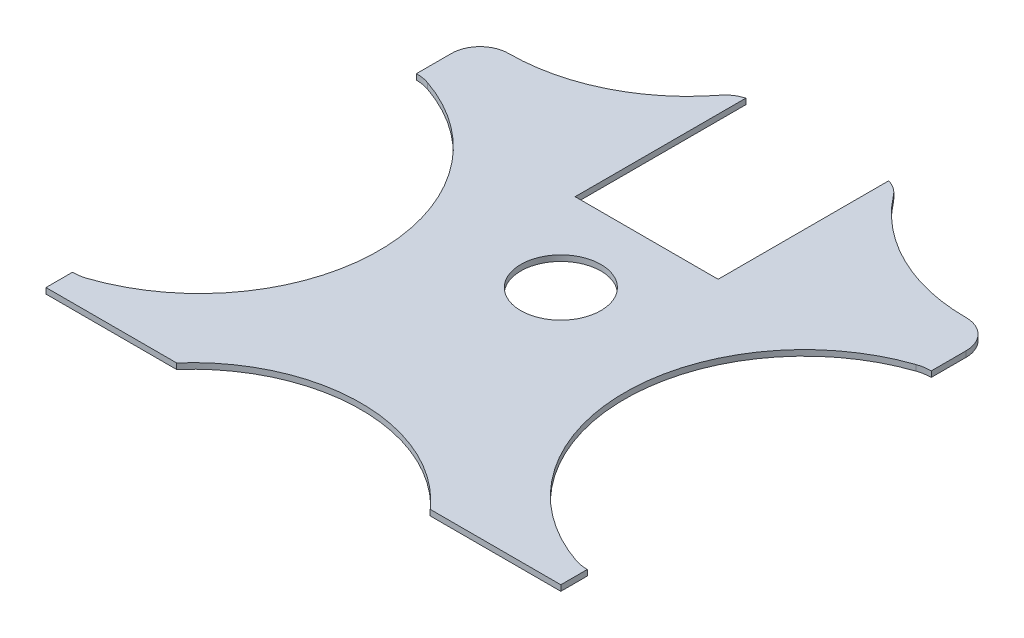
ISO-10303-21;
HEADER;
FILE_DESCRIPTION(('STEP AP214'),'2;1');
FILE_NAME('part.step','',(''),(''),'','','');
FILE_SCHEMA(('AUTOMOTIVE_DESIGN { 1 0 10303 214 1 1 1 1 }'));
ENDSEC;
DATA;
#1=APPLICATION_CONTEXT('core data for automotive mechanical design processes');
#2=APPLICATION_PROTOCOL_DEFINITION('international standard','automotive_design',2000,#1);
#3=PRODUCT_CONTEXT('',#1,'mechanical');
#4=PRODUCT('Part','Part','',(#3));
#5=PRODUCT_RELATED_PRODUCT_CATEGORY('part','',(#4));
#6=PRODUCT_DEFINITION_FORMATION('','',#4);
#7=PRODUCT_DEFINITION_CONTEXT('part definition',#1,'design');
#8=PRODUCT_DEFINITION('design','',#6,#7);
#9=PRODUCT_DEFINITION_SHAPE('','',#8);
#10=(LENGTH_UNIT() NAMED_UNIT(*) SI_UNIT(.MILLI.,.METRE.));
#11=(NAMED_UNIT(*) PLANE_ANGLE_UNIT() SI_UNIT($,.RADIAN.));
#12=(NAMED_UNIT(*) SI_UNIT($,.STERADIAN.) SOLID_ANGLE_UNIT());
#13=UNCERTAINTY_MEASURE_WITH_UNIT(LENGTH_MEASURE(1.E-05),#10,'distance_accuracy_value','');
#14=(GEOMETRIC_REPRESENTATION_CONTEXT(3) GLOBAL_UNCERTAINTY_ASSIGNED_CONTEXT((#13)) GLOBAL_UNIT_ASSIGNED_CONTEXT((#10,
#11,#12)) REPRESENTATION_CONTEXT('',''));
#15=CARTESIAN_POINT('',(0.,0.,0.));
#16=DIRECTION('',(0.,0.,1.));
#17=DIRECTION('',(1.,0.,0.));
#18=AXIS2_PLACEMENT_3D('',#15,#16,#17);
#19=CARTESIAN_POINT('',(90.,2.,90.));
#20=DIRECTION('',(-1.,0.,0.));
#21=DIRECTION('',(0.,0.,1.));
#22=AXIS2_PLACEMENT_3D('',#19,#20,#21);
#23=PLANE('',#22);
#24=DIRECTION('',(0.,1.,0.));
#25=VECTOR('',#24,1.);
#26=CARTESIAN_POINT('',(90.,-1.,-51.7417552269774));
#27=LINE('',#26,#25);
#28=CARTESIAN_POINT('',(90.,0.,-51.7417552269774));
#29=VERTEX_POINT('',#28);
#30=CARTESIAN_POINT('',(90.,2.,-51.7417552269774));
#31=VERTEX_POINT('',#30);
#32=EDGE_CURVE('E339',#29,#31,#27,.T.);
#33=ORIENTED_EDGE('',*,*,#32,.T.);
#34=DIRECTION('',(0.,0.,-1.));
#35=VECTOR('',#34,1.);
#36=CARTESIAN_POINT('',(90.,2.,90.));
#37=LINE('',#36,#35);
#38=CARTESIAN_POINT('',(90.,2.,-39.5269876063135));
#39=VERTEX_POINT('',#38);
#40=EDGE_CURVE('E228',#39,#31,#37,.T.);
#41=ORIENTED_EDGE('',*,*,#40,.F.);
#42=DIRECTION('',(0.,1.,0.));
#43=VECTOR('',#42,1.);
#44=CARTESIAN_POINT('',(90.,-8.,-39.5269876063135));
#45=LINE('',#44,#43);
#46=CARTESIAN_POINT('',(90.,0.,-39.5269876063135));
#47=VERTEX_POINT('',#46);
#48=EDGE_CURVE('E316',#47,#39,#45,.T.);
#49=ORIENTED_EDGE('',*,*,#48,.F.);
#50=DIRECTION('',(0.,0.,-1.));
#51=VECTOR('',#50,1.);
#52=CARTESIAN_POINT('',(90.,0.,90.));
#53=LINE('',#52,#51);
#54=EDGE_CURVE('E221',#47,#29,#53,.T.);
#55=ORIENTED_EDGE('',*,*,#54,.T.);
#56=EDGE_LOOP('',(#33,#41,#49,#55));
#57=FACE_BOUND('',#56,.T.);
#58=ADVANCED_FACE('F33',(#57),#23,.F.);
#59=CARTESIAN_POINT('',(-90.,2.,90.));
#60=DIRECTION('',(0.,0.,-1.));
#61=DIRECTION('',(-1.,0.,0.));
#62=AXIS2_PLACEMENT_3D('',#59,#60,#61);
#63=PLANE('',#62);
#64=DIRECTION('',(1.,0.,0.));
#65=VECTOR('',#64,1.);
#66=CARTESIAN_POINT('',(-90.,2.,90.));
#67=LINE('',#66,#65);
#68=CARTESIAN_POINT('',(44.3381268338623,2.,90.));
#69=VERTEX_POINT('',#68);
#70=CARTESIAN_POINT('',(90.,2.,90.));
#71=VERTEX_POINT('',#70);
#72=EDGE_CURVE('E206',#69,#71,#67,.T.);
#73=ORIENTED_EDGE('',*,*,#72,.F.);
#74=DIRECTION('',(0.,-1.,0.));
#75=VECTOR('',#74,1.);
#76=CARTESIAN_POINT('',(44.3381268338623,320.20787230991,90.));
#77=LINE('',#76,#75);
#78=CARTESIAN_POINT('',(44.3381268338623,0.,90.));
#79=VERTEX_POINT('',#78);
#80=EDGE_CURVE('E253',#69,#79,#77,.T.);
#81=ORIENTED_EDGE('',*,*,#80,.T.);
#82=DIRECTION('',(1.,0.,0.));
#83=VECTOR('',#82,1.);
#84=CARTESIAN_POINT('',(-90.,0.,90.));
#85=LINE('',#84,#83);
#86=CARTESIAN_POINT('',(90.,0.,90.));
#87=VERTEX_POINT('',#86);
#88=EDGE_CURVE('E224',#79,#87,#85,.T.);
#89=ORIENTED_EDGE('',*,*,#88,.T.);
#90=DIRECTION('',(0.,-1.,0.));
#91=VECTOR('',#90,1.);
#92=CARTESIAN_POINT('',(90.,2.,90.));
#93=LINE('',#92,#91);
#94=EDGE_CURVE('E216',#71,#87,#93,.T.);
#95=ORIENTED_EDGE('',*,*,#94,.F.);
#96=EDGE_LOOP('',(#73,#81,#89,#95));
#97=FACE_BOUND('',#96,.T.);
#98=ADVANCED_FACE('F394',(#97),#63,.F.);
#99=DIRECTION('',(0.,1.,0.));
#100=VECTOR('',#99,1.);
#101=CARTESIAN_POINT('',(90.,-8.,80.7603527714543));
#102=LINE('',#101,#100);
#103=CARTESIAN_POINT('',(90.,2.,80.7603527714543));
#104=VERTEX_POINT('',#103);
#105=CARTESIAN_POINT('',(90.,0.,80.7603527714543));
#106=VERTEX_POINT('',#105);
#107=EDGE_CURVE('E314',#104,#106,#102,.F.);
#108=ORIENTED_EDGE('',*,*,#107,.F.);
#109=EDGE_CURVE('E211',#71,#104,#37,.T.);
#110=ORIENTED_EDGE('',*,*,#109,.F.);
#111=ORIENTED_EDGE('',*,*,#94,.T.);
#112=EDGE_CURVE('E217',#87,#106,#53,.T.);
#113=ORIENTED_EDGE('',*,*,#112,.T.);
#114=EDGE_LOOP('',(#108,#110,#111,#113));
#115=FACE_BOUND('',#114,.T.);
#116=ADVANCED_FACE('F35',(#115),#23,.F.);
#117=CARTESIAN_POINT('',(89.9999999999999,2.,-90.));
#118=DIRECTION('',(0.,-1.,0.));
#119=DIRECTION('',(0.,0.,-1.));
#120=AXIS2_PLACEMENT_3D('',#117,#118,#119);
#121=PLANE('',#120);
#122=CARTESIAN_POINT('',(0.,2.,0.));
#123=DIRECTION('',(0.,1.,0.));
#124=DIRECTION('',(0.,0.,1.));
#125=AXIS2_PLACEMENT_3D('',#122,#123,#124);
#126=CIRCLE('',#125,14.);
#127=CARTESIAN_POINT('',(0.,2.,14.));
#128=VERTEX_POINT('',#127);
#129=EDGE_CURVE('E261',#128,#128,#126,.T.);
#130=ORIENTED_EDGE('',*,*,#129,.F.);
#131=EDGE_LOOP('',(#130));
#132=FACE_BOUND('',#131,.T.);
#133=DIRECTION('',(0.,0.,1.));
#134=VECTOR('',#133,1.);
#135=CARTESIAN_POINT('',(-25.,2.,-30.));
#136=LINE('',#135,#134);
#137=CARTESIAN_POINT('',(-25.,2.,-89.6654970319852));
#138=VERTEX_POINT('',#137);
#139=CARTESIAN_POINT('',(-25.,2.,-30.));
#140=VERTEX_POINT('',#139);
#141=EDGE_CURVE('E271',#138,#140,#136,.T.);
#142=ORIENTED_EDGE('',*,*,#141,.F.);
#143=CARTESIAN_POINT('',(-22.4352062218018,2.,-80.));
#144=DIRECTION('',(0.,-1.,0.));
#145=DIRECTION('',(0.,0.,1.));
#146=AXIS2_PLACEMENT_3D('',#143,#144,#145);
#147=CIRCLE('',#146,10.);
#148=CARTESIAN_POINT('',(-30.3487350459833,2.,-86.1135964496234));
#149=VERTEX_POINT('',#148);
#150=EDGE_CURVE('E48',#149,#138,#147,.T.);
#151=ORIENTED_EDGE('',*,*,#150,.F.);
#152=CARTESIAN_POINT('',(-79.9749585899109,2.,-124.452333921494));
#153=DIRECTION('',(0.,1.,0.));
#154=DIRECTION('',(0.,0.,-1.));
#155=AXIS2_PLACEMENT_3D('',#152,#153,#154);
#156=CIRCLE('',#155,62.7106119741217);
#157=CARTESIAN_POINT('',(-79.9965560171467,2.,-61.7417256664304));
#158=VERTEX_POINT('',#157);
#159=EDGE_CURVE('E200',#158,#149,#156,.T.);
#160=ORIENTED_EDGE('',*,*,#159,.F.);
#161=CARTESIAN_POINT('',(-80.,2.,-51.7417262594813));
#162=DIRECTION('',(0.,-1.,0.));
#163=DIRECTION('',(0.,0.,1.));
#164=AXIS2_PLACEMENT_3D('',#161,#162,#163);
#165=CIRCLE('',#164,10.);
#166=CARTESIAN_POINT('',(-90.,2.,-51.7417262594813));
#167=VERTEX_POINT('',#166);
#168=EDGE_CURVE('E185',#167,#158,#165,.T.);
#169=ORIENTED_EDGE('',*,*,#168,.F.);
#170=DIRECTION('',(0.,0.,1.));
#171=VECTOR('',#170,1.);
#172=CARTESIAN_POINT('',(-90.,2.,90.));
#173=LINE('',#172,#171);
#174=CARTESIAN_POINT('',(-90.,2.,-39.5269876063135));
#175=VERTEX_POINT('',#174);
#176=EDGE_CURVE('E197',#167,#175,#173,.T.);
#177=ORIENTED_EDGE('',*,*,#176,.T.);
#178=CARTESIAN_POINT('',(-90.,2.,-25.240567198271));
#179=DIRECTION('',(0.,1.,0.));
#180=DIRECTION('',(0.,0.,1.));
#181=AXIS2_PLACEMENT_3D('',#178,#179,#180);
#182=CIRCLE('',#181,14.2864204080424);
#183=CARTESIAN_POINT('',(-85.36891039222,2.,-38.7555521083641));
#184=VERTEX_POINT('',#183);
#185=EDGE_CURVE('E306',#184,#175,#182,.T.);
#186=ORIENTED_EDGE('',*,*,#185,.F.);
#187=CARTESIAN_POINT('',(-105.71359748562,2.,20.6166825825704));
#188=DIRECTION('',(0.,1.,0.));
#189=DIRECTION('',(0.,0.,1.));
#190=AXIS2_PLACEMENT_3D('',#187,#188,#189);
#191=CIRCLE('',#190,62.7612025468263);
#192=CARTESIAN_POINT('',(-85.36891039222,2.,79.988917273505));
#193=VERTEX_POINT('',#192);
#194=EDGE_CURVE('E309',#193,#184,#191,.T.);
#195=ORIENTED_EDGE('',*,*,#194,.F.);
#196=CARTESIAN_POINT('',(-90.,2.,66.4739323634119));
#197=DIRECTION('',(0.,1.,0.));
#198=DIRECTION('',(0.,0.,1.));
#199=AXIS2_PLACEMENT_3D('',#196,#197,#198);
#200=CIRCLE('',#199,14.2864204080424);
#201=CARTESIAN_POINT('',(-90.,2.,80.7603527714543));
#202=VERTEX_POINT('',#201);
#203=EDGE_CURVE('E312',#202,#193,#200,.T.);
#204=ORIENTED_EDGE('',*,*,#203,.F.);
#205=CARTESIAN_POINT('',(-90.,2.,90.));
#206=VERTEX_POINT('',#205);
#207=EDGE_CURVE('E207',#202,#206,#173,.T.);
#208=ORIENTED_EDGE('',*,*,#207,.T.);
#209=CARTESIAN_POINT('',(-44.3381268338623,2.,90.));
#210=VERTEX_POINT('',#209);
#211=EDGE_CURVE('E209',#206,#210,#67,.T.);
#212=ORIENTED_EDGE('',*,*,#211,.T.);
#213=CARTESIAN_POINT('',(0.,2.,128.863940193895));
#214=DIRECTION('',(0.,-1.,0.));
#215=DIRECTION('',(0.,0.,-1.));
#216=AXIS2_PLACEMENT_3D('',#213,#214,#215);
#217=CIRCLE('',#216,58.9599469006742);
#218=EDGE_CURVE('E331',#210,#69,#217,.T.);
#219=ORIENTED_EDGE('',*,*,#218,.T.);
#220=ORIENTED_EDGE('',*,*,#72,.T.);
#221=ORIENTED_EDGE('',*,*,#109,.T.);
#222=CARTESIAN_POINT('',(90.,2.,66.4739323634119));
#223=DIRECTION('',(0.,-1.,0.));
#224=DIRECTION('',(0.,0.,1.));
#225=AXIS2_PLACEMENT_3D('',#222,#223,#224);
#226=CIRCLE('',#225,14.2864204080424);
#227=CARTESIAN_POINT('',(85.36891039222,2.,79.988917273505));
#228=VERTEX_POINT('',#227);
#229=EDGE_CURVE('E328',#104,#228,#226,.T.);
#230=ORIENTED_EDGE('',*,*,#229,.T.);
#231=CARTESIAN_POINT('',(105.71359748562,2.,20.6166825825704));
#232=DIRECTION('',(0.,-1.,0.));
#233=DIRECTION('',(0.,0.,1.));
#234=AXIS2_PLACEMENT_3D('',#231,#232,#233);
#235=CIRCLE('',#234,62.7612025468263);
#236=CARTESIAN_POINT('',(85.36891039222,2.,-38.7555521083641));
#237=VERTEX_POINT('',#236);
#238=EDGE_CURVE('E321',#228,#237,#235,.T.);
#239=ORIENTED_EDGE('',*,*,#238,.T.);
#240=CARTESIAN_POINT('',(90.,2.,-25.240567198271));
#241=DIRECTION('',(0.,-1.,0.));
#242=DIRECTION('',(0.,0.,1.));
#243=AXIS2_PLACEMENT_3D('',#240,#241,#242);
#244=CIRCLE('',#243,14.2864204080424);
#245=EDGE_CURVE('E325',#237,#39,#244,.T.);
#246=ORIENTED_EDGE('',*,*,#245,.T.);
#247=ORIENTED_EDGE('',*,*,#40,.T.);
#248=CARTESIAN_POINT('',(80.,2.,-51.7417552269774));
#249=DIRECTION('',(0.,-1.,0.));
#250=DIRECTION('',(0.,0.,1.));
#251=AXIS2_PLACEMENT_3D('',#248,#249,#250);
#252=CIRCLE('',#251,10.);
#253=CARTESIAN_POINT('',(79.9756851883454,2.,-61.7417256664306));
#254=VERTEX_POINT('',#253);
#255=EDGE_CURVE('E351',#254,#31,#252,.T.);
#256=ORIENTED_EDGE('',*,*,#255,.F.);
#257=CARTESIAN_POINT('',(79.8232055164563,2.,-124.452152264553));
#258=DIRECTION('',(0.,1.,0.));
#259=DIRECTION('',(0.,0.,1.));
#260=AXIS2_PLACEMENT_3D('',#257,#258,#259);
#261=CIRCLE('',#260,62.7106119741218);
#262=CARTESIAN_POINT('',(30.1968609349029,2.,-86.1135714660707));
#263=VERTEX_POINT('',#262);
#264=EDGE_CURVE('E343',#263,#254,#261,.T.);
#265=ORIENTED_EDGE('',*,*,#264,.F.);
#266=CARTESIAN_POINT('',(22.2833128097415,2.,-80.));
#267=DIRECTION('',(0.,-1.,0.));
#268=DIRECTION('',(0.,0.,1.));
#269=AXIS2_PLACEMENT_3D('',#266,#267,#268);
#270=CIRCLE('',#269,10.);
#271=CARTESIAN_POINT('',(25.,2.,-89.6239082866726));
#272=VERTEX_POINT('',#271);
#273=EDGE_CURVE('E348',#272,#263,#270,.T.);
#274=ORIENTED_EDGE('',*,*,#273,.F.);
#275=DIRECTION('',(0.,0.,-1.));
#276=VECTOR('',#275,1.);
#277=CARTESIAN_POINT('',(25.,2.,-30.));
#278=LINE('',#277,#276);
#279=CARTESIAN_POINT('',(25.,2.,-30.));
#280=VERTEX_POINT('',#279);
#281=EDGE_CURVE('E281',#280,#272,#278,.T.);
#282=ORIENTED_EDGE('',*,*,#281,.F.);
#283=DIRECTION('',(1.,0.,0.));
#284=VECTOR('',#283,1.);
#285=CARTESIAN_POINT('',(25.,2.,-30.));
#286=LINE('',#285,#284);
#287=EDGE_CURVE('E278',#140,#280,#286,.T.);
#288=ORIENTED_EDGE('',*,*,#287,.F.);
#289=EDGE_LOOP('',(#142,#151,#160,#169,#177,#186,#195,#204,#208,#212,#219,#220,#221,#230,#239,
#246,#247,#256,#265,#274,#282,#288));
#290=FACE_BOUND('',#289,.T.);
#291=ADVANCED_FACE('F195',(#132,#290),#121,.F.);
#292=CARTESIAN_POINT('',(89.9999999999999,0.,-90.));
#293=DIRECTION('',(0.,-1.,0.));
#294=DIRECTION('',(0.,0.,-1.));
#295=AXIS2_PLACEMENT_3D('',#292,#293,#294);
#296=PLANE('',#295);
#297=CARTESIAN_POINT('',(-22.4352062218018,0.,-80.));
#298=DIRECTION('',(0.,-1.,0.));
#299=DIRECTION('',(0.,0.,-1.));
#300=AXIS2_PLACEMENT_3D('',#297,#298,#299);
#301=CIRCLE('',#300,10.);
#302=CARTESIAN_POINT('',(-25.,0.,-89.6654970319852));
#303=VERTEX_POINT('',#302);
#304=CARTESIAN_POINT('',(-30.3487350459833,0.,-86.1135964496234));
#305=VERTEX_POINT('',#304);
#306=EDGE_CURVE('E354',#303,#305,#301,.F.);
#307=ORIENTED_EDGE('',*,*,#306,.F.);
#308=DIRECTION('',(0.,0.,1.));
#309=VECTOR('',#308,1.);
#310=CARTESIAN_POINT('',(-25.,0.,-30.));
#311=LINE('',#310,#309);
#312=CARTESIAN_POINT('',(-25.,0.,-30.));
#313=VERTEX_POINT('',#312);
#314=EDGE_CURVE('E273',#303,#313,#311,.T.);
#315=ORIENTED_EDGE('',*,*,#314,.T.);
#316=DIRECTION('',(1.,0.,0.));
#317=VECTOR('',#316,1.);
#318=CARTESIAN_POINT('',(25.,0.,-30.));
#319=LINE('',#318,#317);
#320=CARTESIAN_POINT('',(25.,0.,-30.));
#321=VERTEX_POINT('',#320);
#322=EDGE_CURVE('E296',#313,#321,#319,.T.);
#323=ORIENTED_EDGE('',*,*,#322,.T.);
#324=DIRECTION('',(0.,0.,-1.));
#325=VECTOR('',#324,1.);
#326=CARTESIAN_POINT('',(25.,0.,-30.));
#327=LINE('',#326,#325);
#328=CARTESIAN_POINT('',(25.,0.,-89.6239082866726));
#329=VERTEX_POINT('',#328);
#330=EDGE_CURVE('E286',#321,#329,#327,.T.);
#331=ORIENTED_EDGE('',*,*,#330,.T.);
#332=CARTESIAN_POINT('',(22.2833128097415,0.,-80.));
#333=DIRECTION('',(0.,-1.,0.));
#334=DIRECTION('',(0.,0.,-1.));
#335=AXIS2_PLACEMENT_3D('',#332,#333,#334);
#336=CIRCLE('',#335,10.);
#337=CARTESIAN_POINT('',(30.1968609349029,0.,-86.1135714660707));
#338=VERTEX_POINT('',#337);
#339=EDGE_CURVE('E56',#338,#329,#336,.F.);
#340=ORIENTED_EDGE('',*,*,#339,.F.);
#341=CARTESIAN_POINT('',(79.8232055164563,0.,-124.452152264553));
#342=DIRECTION('',(0.,-1.,0.));
#343=DIRECTION('',(0.,0.,-1.));
#344=AXIS2_PLACEMENT_3D('',#341,#342,#343);
#345=CIRCLE('',#344,62.7106119741218);
#346=CARTESIAN_POINT('',(79.9756851883454,0.,-61.7417256664306));
#347=VERTEX_POINT('',#346);
#348=EDGE_CURVE('E263',#347,#338,#345,.T.);
#349=ORIENTED_EDGE('',*,*,#348,.F.);
#350=CARTESIAN_POINT('',(80.,0.,-51.7417552269774));
#351=DIRECTION('',(0.,-1.,0.));
#352=DIRECTION('',(0.,0.,-1.));
#353=AXIS2_PLACEMENT_3D('',#350,#351,#352);
#354=CIRCLE('',#353,10.);
#355=EDGE_CURVE('E265',#29,#347,#354,.F.);
#356=ORIENTED_EDGE('',*,*,#355,.F.);
#357=ORIENTED_EDGE('',*,*,#54,.F.);
#358=CARTESIAN_POINT('',(90.,0.,-25.240567198271));
#359=DIRECTION('',(0.,-1.,0.));
#360=DIRECTION('',(0.,0.,-1.));
#361=AXIS2_PLACEMENT_3D('',#358,#359,#360);
#362=CIRCLE('',#361,14.2864204080424);
#363=CARTESIAN_POINT('',(85.36891039222,0.,-38.7555521083641));
#364=VERTEX_POINT('',#363);
#365=EDGE_CURVE('E241',#47,#364,#362,.F.);
#366=ORIENTED_EDGE('',*,*,#365,.T.);
#367=CARTESIAN_POINT('',(105.71359748562,0.,20.6166825825704));
#368=DIRECTION('',(0.,-1.,0.));
#369=DIRECTION('',(0.,0.,-1.));
#370=AXIS2_PLACEMENT_3D('',#367,#368,#369);
#371=CIRCLE('',#370,62.7612025468263);
#372=CARTESIAN_POINT('',(85.36891039222,0.,79.988917273505));
#373=VERTEX_POINT('',#372);
#374=EDGE_CURVE('E244',#364,#373,#371,.F.);
#375=ORIENTED_EDGE('',*,*,#374,.T.);
#376=CARTESIAN_POINT('',(90.,0.,66.4739323634119));
#377=DIRECTION('',(0.,-1.,0.));
#378=DIRECTION('',(0.,0.,-1.));
#379=AXIS2_PLACEMENT_3D('',#376,#377,#378);
#380=CIRCLE('',#379,14.2864204080424);
#381=EDGE_CURVE('E247',#373,#106,#380,.F.);
#382=ORIENTED_EDGE('',*,*,#381,.T.);
#383=ORIENTED_EDGE('',*,*,#112,.F.);
#384=ORIENTED_EDGE('',*,*,#88,.F.);
#385=CARTESIAN_POINT('',(0.,0.,128.863940193895));
#386=DIRECTION('',(0.,-1.,0.));
#387=DIRECTION('',(0.,0.,-1.));
#388=AXIS2_PLACEMENT_3D('',#385,#386,#387);
#389=CIRCLE('',#388,58.9599469006742);
#390=CARTESIAN_POINT('',(-44.3381268338623,0.,90.));
#391=VERTEX_POINT('',#390);
#392=EDGE_CURVE('E260',#391,#79,#389,.T.);
#393=ORIENTED_EDGE('',*,*,#392,.F.);
#394=CARTESIAN_POINT('',(-90.,0.,90.));
#395=VERTEX_POINT('',#394);
#396=EDGE_CURVE('E225',#395,#391,#85,.T.);
#397=ORIENTED_EDGE('',*,*,#396,.F.);
#398=DIRECTION('',(0.,0.,1.));
#399=VECTOR('',#398,1.);
#400=CARTESIAN_POINT('',(-90.,0.,90.));
#401=LINE('',#400,#399);
#402=CARTESIAN_POINT('',(-90.,0.,80.7603527714543));
#403=VERTEX_POINT('',#402);
#404=EDGE_CURVE('E220',#403,#395,#401,.T.);
#405=ORIENTED_EDGE('',*,*,#404,.F.);
#406=CARTESIAN_POINT('',(-90.,0.,66.4739323634119));
#407=DIRECTION('',(0.,-1.,0.));
#408=DIRECTION('',(0.,0.,-1.));
#409=AXIS2_PLACEMENT_3D('',#406,#407,#408);
#410=CIRCLE('',#409,14.2864204080424);
#411=CARTESIAN_POINT('',(-85.36891039222,0.,79.988917273505));
#412=VERTEX_POINT('',#411);
#413=EDGE_CURVE('E239',#412,#403,#410,.T.);
#414=ORIENTED_EDGE('',*,*,#413,.F.);
#415=CARTESIAN_POINT('',(-105.71359748562,0.,20.6166825825704));
#416=DIRECTION('',(0.,-1.,0.));
#417=DIRECTION('',(0.,0.,-1.));
#418=AXIS2_PLACEMENT_3D('',#415,#416,#417);
#419=CIRCLE('',#418,62.7612025468263);
#420=CARTESIAN_POINT('',(-85.36891039222,0.,-38.7555521083641));
#421=VERTEX_POINT('',#420);
#422=EDGE_CURVE('E234',#421,#412,#419,.T.);
#423=ORIENTED_EDGE('',*,*,#422,.F.);
#424=CARTESIAN_POINT('',(-90.,0.,-25.240567198271));
#425=DIRECTION('',(0.,-1.,0.));
#426=DIRECTION('',(0.,0.,-1.));
#427=AXIS2_PLACEMENT_3D('',#424,#425,#426);
#428=CIRCLE('',#427,14.2864204080424);
#429=CARTESIAN_POINT('',(-90.,0.,-39.5269876063135));
#430=VERTEX_POINT('',#429);
#431=EDGE_CURVE('E236',#430,#421,#428,.T.);
#432=ORIENTED_EDGE('',*,*,#431,.F.);
#433=CARTESIAN_POINT('',(-90.,0.,-51.7417262594813));
#434=VERTEX_POINT('',#433);
#435=EDGE_CURVE('E222',#434,#430,#401,.T.);
#436=ORIENTED_EDGE('',*,*,#435,.F.);
#437=CARTESIAN_POINT('',(-80.,0.,-51.7417262594813));
#438=DIRECTION('',(0.,-1.,0.));
#439=DIRECTION('',(0.,0.,-1.));
#440=AXIS2_PLACEMENT_3D('',#437,#438,#439);
#441=CIRCLE('',#440,10.);
#442=CARTESIAN_POINT('',(-79.9965560171467,0.,-61.7417256664304));
#443=VERTEX_POINT('',#442);
#444=EDGE_CURVE('E188',#443,#434,#441,.F.);
#445=ORIENTED_EDGE('',*,*,#444,.F.);
#446=CARTESIAN_POINT('',(-79.9749585899109,0.,-124.452333921494));
#447=DIRECTION('',(0.,-1.,0.));
#448=DIRECTION('',(0.,0.,-1.));
#449=AXIS2_PLACEMENT_3D('',#446,#447,#448);
#450=CIRCLE('',#449,62.7106119741217);
#451=EDGE_CURVE('E11',#305,#443,#450,.T.);
#452=ORIENTED_EDGE('',*,*,#451,.F.);
#453=EDGE_LOOP('',(#307,#315,#323,#331,#340,#349,#356,#357,#366,#375,#382,#383,#384,#393,#397,
#405,#414,#423,#432,#436,#445,#452));
#454=FACE_BOUND('',#453,.T.);
#455=CARTESIAN_POINT('',(0.,0.,0.));
#456=DIRECTION('',(0.,-1.,0.));
#457=DIRECTION('',(0.,0.,-1.));
#458=AXIS2_PLACEMENT_3D('',#455,#456,#457);
#459=CIRCLE('',#458,14.);
#460=CARTESIAN_POINT('',(0.,0.,-14.));
#461=VERTEX_POINT('',#460);
#462=EDGE_CURVE('E257',#461,#461,#459,.T.);
#463=ORIENTED_EDGE('',*,*,#462,.F.);
#464=EDGE_LOOP('',(#463));
#465=FACE_BOUND('',#464,.T.);
#466=ADVANCED_FACE('F365',(#454,#465),#296,.T.);
#467=CARTESIAN_POINT('',(-90.,2.,90.));
#468=DIRECTION('',(1.,0.,0.));
#469=DIRECTION('',(0.,0.,-1.));
#470=AXIS2_PLACEMENT_3D('',#467,#468,#469);
#471=PLANE('',#470);
#472=ORIENTED_EDGE('',*,*,#207,.F.);
#473=DIRECTION('',(0.,1.,0.));
#474=VECTOR('',#473,1.);
#475=CARTESIAN_POINT('',(-90.,-8.,80.7603527714543));
#476=LINE('',#475,#474);
#477=EDGE_CURVE('E279',#202,#403,#476,.F.);
#478=ORIENTED_EDGE('',*,*,#477,.T.);
#479=ORIENTED_EDGE('',*,*,#404,.T.);
#480=DIRECTION('',(0.,-1.,0.));
#481=VECTOR('',#480,1.);
#482=CARTESIAN_POINT('',(-90.,2.,90.));
#483=LINE('',#482,#481);
#484=EDGE_CURVE('E231',#206,#395,#483,.T.);
#485=ORIENTED_EDGE('',*,*,#484,.F.);
#486=EDGE_LOOP('',(#472,#478,#479,#485));
#487=FACE_BOUND('',#486,.T.);
#488=ADVANCED_FACE('F385',(#487),#471,.F.);
#489=ORIENTED_EDGE('',*,*,#176,.F.);
#490=DIRECTION('',(0.,1.,0.));
#491=VECTOR('',#490,1.);
#492=CARTESIAN_POINT('',(-90.,-1.,-51.7417262594813));
#493=LINE('',#492,#491);
#494=EDGE_CURVE('E41',#167,#434,#493,.F.);
#495=ORIENTED_EDGE('',*,*,#494,.T.);
#496=ORIENTED_EDGE('',*,*,#435,.T.);
#497=DIRECTION('',(0.,1.,0.));
#498=VECTOR('',#497,1.);
#499=CARTESIAN_POINT('',(-90.,-8.,-39.5269876063135));
#500=LINE('',#499,#498);
#501=EDGE_CURVE('E205',#430,#175,#500,.T.);
#502=ORIENTED_EDGE('',*,*,#501,.T.);
#503=EDGE_LOOP('',(#489,#495,#496,#502));
#504=FACE_BOUND('',#503,.T.);
#505=ADVANCED_FACE('F203',(#504),#471,.F.);
#506=ORIENTED_EDGE('',*,*,#396,.T.);
#507=DIRECTION('',(0.,-1.,0.));
#508=VECTOR('',#507,1.);
#509=CARTESIAN_POINT('',(-44.3381268338623,320.20787230991,90.));
#510=LINE('',#509,#508);
#511=EDGE_CURVE('E250',#391,#210,#510,.F.);
#512=ORIENTED_EDGE('',*,*,#511,.T.);
#513=ORIENTED_EDGE('',*,*,#211,.F.);
#514=ORIENTED_EDGE('',*,*,#484,.T.);
#515=EDGE_LOOP('',(#506,#512,#513,#514));
#516=FACE_BOUND('',#515,.T.);
#517=ADVANCED_FACE('F388',(#516),#63,.F.);
#518=CARTESIAN_POINT('',(-25.,0.,-30.));
#519=DIRECTION('',(-1.,0.,0.));
#520=DIRECTION('',(0.,0.,1.));
#521=AXIS2_PLACEMENT_3D('',#518,#519,#520);
#522=PLANE('',#521);
#523=ORIENTED_EDGE('',*,*,#314,.F.);
#524=DIRECTION('',(0.,1.,0.));
#525=VECTOR('',#524,1.);
#526=CARTESIAN_POINT('',(-25.,-1.,-89.6654970319852));
#527=LINE('',#526,#525);
#528=EDGE_CURVE('E192',#303,#138,#527,.T.);
#529=ORIENTED_EDGE('',*,*,#528,.T.);
#530=ORIENTED_EDGE('',*,*,#141,.T.);
#531=DIRECTION('',(0.,1.,0.));
#532=VECTOR('',#531,1.);
#533=CARTESIAN_POINT('',(-25.,0.,-30.));
#534=LINE('',#533,#532);
#535=EDGE_CURVE('E292',#313,#140,#534,.T.);
#536=ORIENTED_EDGE('',*,*,#535,.F.);
#537=EDGE_LOOP('',(#523,#529,#530,#536));
#538=FACE_BOUND('',#537,.T.);
#539=ADVANCED_FACE('F269',(#538),#522,.F.);
#540=CARTESIAN_POINT('',(25.,0.,-30.));
#541=DIRECTION('',(1.,0.,0.));
#542=DIRECTION('',(0.,0.,-1.));
#543=AXIS2_PLACEMENT_3D('',#540,#541,#542);
#544=PLANE('',#543);
#545=ORIENTED_EDGE('',*,*,#281,.T.);
#546=DIRECTION('',(0.,1.,0.));
#547=VECTOR('',#546,1.);
#548=CARTESIAN_POINT('',(25.,-1.,-89.6239082866726));
#549=LINE('',#548,#547);
#550=EDGE_CURVE('E256',#272,#329,#549,.F.);
#551=ORIENTED_EDGE('',*,*,#550,.T.);
#552=ORIENTED_EDGE('',*,*,#330,.F.);
#553=DIRECTION('',(0.,1.,0.));
#554=VECTOR('',#553,1.);
#555=CARTESIAN_POINT('',(25.,0.,-30.));
#556=LINE('',#555,#554);
#557=EDGE_CURVE('E291',#321,#280,#556,.T.);
#558=ORIENTED_EDGE('',*,*,#557,.T.);
#559=EDGE_LOOP('',(#545,#551,#552,#558));
#560=FACE_BOUND('',#559,.T.);
#561=ADVANCED_FACE('F419',(#560),#544,.F.);
#562=CARTESIAN_POINT('',(25.,0.,-30.));
#563=DIRECTION('',(0.,0.,1.));
#564=DIRECTION('',(1.,0.,0.));
#565=AXIS2_PLACEMENT_3D('',#562,#563,#564);
#566=PLANE('',#565);
#567=ORIENTED_EDGE('',*,*,#287,.T.);
#568=ORIENTED_EDGE('',*,*,#557,.F.);
#569=ORIENTED_EDGE('',*,*,#322,.F.);
#570=ORIENTED_EDGE('',*,*,#535,.T.);
#571=EDGE_LOOP('',(#567,#568,#569,#570));
#572=FACE_BOUND('',#571,.T.);
#573=ADVANCED_FACE('F421',(#572),#566,.F.);
#574=CARTESIAN_POINT('',(-90.,-8.,66.4739323634119));
#575=DIRECTION('',(0.,1.,0.));
#576=DIRECTION('',(0.,0.,1.));
#577=AXIS2_PLACEMENT_3D('',#574,#575,#576);
#578=CYLINDRICAL_SURFACE('',#577,14.2864204080424);
#579=ORIENTED_EDGE('',*,*,#203,.T.);
#580=DIRECTION('',(0.,1.,0.));
#581=VECTOR('',#580,1.);
#582=CARTESIAN_POINT('',(-85.36891039222,-8.,79.988917273505));
#583=LINE('',#582,#581);
#584=EDGE_CURVE('E303',#412,#193,#583,.T.);
#585=ORIENTED_EDGE('',*,*,#584,.F.);
#586=ORIENTED_EDGE('',*,*,#413,.T.);
#587=ORIENTED_EDGE('',*,*,#477,.F.);
#588=EDGE_LOOP('',(#579,#585,#586,#587));
#589=FACE_BOUND('',#588,.T.);
#590=ADVANCED_FACE('F379',(#589),#578,.F.);
#591=CARTESIAN_POINT('',(-90.,-8.,-25.240567198271));
#592=DIRECTION('',(0.,1.,0.));
#593=DIRECTION('',(0.,0.,1.));
#594=AXIS2_PLACEMENT_3D('',#591,#592,#593);
#595=CYLINDRICAL_SURFACE('',#594,14.2864204080424);
#596=ORIENTED_EDGE('',*,*,#431,.T.);
#597=DIRECTION('',(0.,1.,0.));
#598=VECTOR('',#597,1.);
#599=CARTESIAN_POINT('',(-85.36891039222,-8.,-38.7555521083641));
#600=LINE('',#599,#598);
#601=EDGE_CURVE('E302',#421,#184,#600,.T.);
#602=ORIENTED_EDGE('',*,*,#601,.T.);
#603=ORIENTED_EDGE('',*,*,#185,.T.);
#604=ORIENTED_EDGE('',*,*,#501,.F.);
#605=EDGE_LOOP('',(#596,#602,#603,#604));
#606=FACE_BOUND('',#605,.T.);
#607=ADVANCED_FACE('F370',(#606),#595,.F.);
#608=CARTESIAN_POINT('',(-105.71359748562,-8.,20.6166825825704));
#609=DIRECTION('',(0.,1.,0.));
#610=DIRECTION('',(0.,0.,1.));
#611=AXIS2_PLACEMENT_3D('',#608,#609,#610);
#612=CYLINDRICAL_SURFACE('',#611,62.7612025468263);
#613=ORIENTED_EDGE('',*,*,#422,.T.);
#614=ORIENTED_EDGE('',*,*,#584,.T.);
#615=ORIENTED_EDGE('',*,*,#194,.T.);
#616=ORIENTED_EDGE('',*,*,#601,.F.);
#617=EDGE_LOOP('',(#613,#614,#615,#616));
#618=FACE_BOUND('',#617,.T.);
#619=ADVANCED_FACE('F375',(#618),#612,.F.);
#620=CARTESIAN_POINT('',(90.,-8.,66.4739323634119));
#621=DIRECTION('',(0.,1.,0.));
#622=DIRECTION('',(0.,0.,1.));
#623=AXIS2_PLACEMENT_3D('',#620,#621,#622);
#624=CYLINDRICAL_SURFACE('',#623,14.2864204080424);
#625=ORIENTED_EDGE('',*,*,#107,.T.);
#626=ORIENTED_EDGE('',*,*,#381,.F.);
#627=DIRECTION('',(0.,1.,0.));
#628=VECTOR('',#627,1.);
#629=CARTESIAN_POINT('',(85.36891039222,-8.,79.988917273505));
#630=LINE('',#629,#628);
#631=EDGE_CURVE('E318',#373,#228,#630,.T.);
#632=ORIENTED_EDGE('',*,*,#631,.T.);
#633=ORIENTED_EDGE('',*,*,#229,.F.);
#634=EDGE_LOOP('',(#625,#626,#632,#633));
#635=FACE_BOUND('',#634,.T.);
#636=ADVANCED_FACE('F556',(#635),#624,.F.);
#637=CARTESIAN_POINT('',(90.,-8.,-25.240567198271));
#638=DIRECTION('',(0.,1.,0.));
#639=DIRECTION('',(0.,0.,1.));
#640=AXIS2_PLACEMENT_3D('',#637,#638,#639);
#641=CYLINDRICAL_SURFACE('',#640,14.2864204080424);
#642=ORIENTED_EDGE('',*,*,#48,.T.);
#643=ORIENTED_EDGE('',*,*,#245,.F.);
#644=DIRECTION('',(0.,1.,0.));
#645=VECTOR('',#644,1.);
#646=CARTESIAN_POINT('',(85.36891039222,-8.,-38.7555521083641));
#647=LINE('',#646,#645);
#648=EDGE_CURVE('E319',#364,#237,#647,.T.);
#649=ORIENTED_EDGE('',*,*,#648,.F.);
#650=ORIENTED_EDGE('',*,*,#365,.F.);
#651=EDGE_LOOP('',(#642,#643,#649,#650));
#652=FACE_BOUND('',#651,.T.);
#653=ADVANCED_FACE('F552',(#652),#641,.F.);
#654=CARTESIAN_POINT('',(105.71359748562,-8.,20.6166825825704));
#655=DIRECTION('',(0.,1.,0.));
#656=DIRECTION('',(0.,0.,1.));
#657=AXIS2_PLACEMENT_3D('',#654,#655,#656);
#658=CYLINDRICAL_SURFACE('',#657,62.7612025468263);
#659=ORIENTED_EDGE('',*,*,#648,.T.);
#660=ORIENTED_EDGE('',*,*,#238,.F.);
#661=ORIENTED_EDGE('',*,*,#631,.F.);
#662=ORIENTED_EDGE('',*,*,#374,.F.);
#663=EDGE_LOOP('',(#659,#660,#661,#662));
#664=FACE_BOUND('',#663,.T.);
#665=ADVANCED_FACE('F549',(#664),#658,.F.);
#666=CARTESIAN_POINT('',(0.,320.20787230991,128.863940193895));
#667=DIRECTION('',(0.,-1.,0.));
#668=DIRECTION('',(0.,0.,-1.));
#669=AXIS2_PLACEMENT_3D('',#666,#667,#668);
#670=CYLINDRICAL_SURFACE('',#669,58.9599469006742);
#671=ORIENTED_EDGE('',*,*,#218,.F.);
#672=ORIENTED_EDGE('',*,*,#511,.F.);
#673=ORIENTED_EDGE('',*,*,#392,.T.);
#674=ORIENTED_EDGE('',*,*,#80,.F.);
#675=EDGE_LOOP('',(#671,#672,#673,#674));
#676=FACE_BOUND('',#675,.T.);
#677=ADVANCED_FACE('F491',(#676),#670,.F.);
#678=CARTESIAN_POINT('',(0.,-1.,0.));
#679=DIRECTION('',(0.,1.,0.));
#680=DIRECTION('',(0.,0.,1.));
#681=AXIS2_PLACEMENT_3D('',#678,#679,#680);
#682=CYLINDRICAL_SURFACE('',#681,14.);
#683=ORIENTED_EDGE('',*,*,#462,.T.);
#684=EDGE_LOOP('',(#683));
#685=FACE_BOUND('',#684,.T.);
#686=ORIENTED_EDGE('',*,*,#129,.T.);
#687=EDGE_LOOP('',(#686));
#688=FACE_BOUND('',#687,.T.);
#689=ADVANCED_FACE('F486',(#685,#688),#682,.F.);
#690=CARTESIAN_POINT('',(80.,-1.,-51.7417552269774));
#691=DIRECTION('',(0.,1.,0.));
#692=DIRECTION('',(0.,0.,1.));
#693=AXIS2_PLACEMENT_3D('',#690,#691,#692);
#694=CYLINDRICAL_SURFACE('',#693,10.);
#695=ORIENTED_EDGE('',*,*,#355,.T.);
#696=DIRECTION('',(0.,1.,0.));
#697=VECTOR('',#696,1.);
#698=CARTESIAN_POINT('',(79.9756851883454,-1.,-61.7417256664306));
#699=LINE('',#698,#697);
#700=EDGE_CURVE('E338',#347,#254,#699,.T.);
#701=ORIENTED_EDGE('',*,*,#700,.T.);
#702=ORIENTED_EDGE('',*,*,#255,.T.);
#703=ORIENTED_EDGE('',*,*,#32,.F.);
#704=EDGE_LOOP('',(#695,#701,#702,#703));
#705=FACE_BOUND('',#704,.T.);
#706=ADVANCED_FACE('F411',(#705),#694,.T.);
#707=CARTESIAN_POINT('',(79.8232055164563,-1.,-124.452152264553));
#708=DIRECTION('',(0.,1.,0.));
#709=DIRECTION('',(0.,0.,1.));
#710=AXIS2_PLACEMENT_3D('',#707,#708,#709);
#711=CYLINDRICAL_SURFACE('',#710,62.7106119741218);
#712=ORIENTED_EDGE('',*,*,#348,.T.);
#713=DIRECTION('',(0.,1.,0.));
#714=VECTOR('',#713,1.);
#715=CARTESIAN_POINT('',(30.1968609349029,-1.,-86.1135714660707));
#716=LINE('',#715,#714);
#717=EDGE_CURVE('E342',#338,#263,#716,.T.);
#718=ORIENTED_EDGE('',*,*,#717,.T.);
#719=ORIENTED_EDGE('',*,*,#264,.T.);
#720=ORIENTED_EDGE('',*,*,#700,.F.);
#721=EDGE_LOOP('',(#712,#718,#719,#720));
#722=FACE_BOUND('',#721,.T.);
#723=ADVANCED_FACE('F415',(#722),#711,.F.);
#724=CARTESIAN_POINT('',(22.2833128097415,-1.,-80.));
#725=DIRECTION('',(0.,1.,0.));
#726=DIRECTION('',(0.,0.,1.));
#727=AXIS2_PLACEMENT_3D('',#724,#725,#726);
#728=CYLINDRICAL_SURFACE('',#727,10.);
#729=ORIENTED_EDGE('',*,*,#339,.T.);
#730=ORIENTED_EDGE('',*,*,#550,.F.);
#731=ORIENTED_EDGE('',*,*,#273,.T.);
#732=ORIENTED_EDGE('',*,*,#717,.F.);
#733=EDGE_LOOP('',(#729,#730,#731,#732));
#734=FACE_BOUND('',#733,.T.);
#735=ADVANCED_FACE('F416',(#734),#728,.T.);
#736=CARTESIAN_POINT('',(-22.4352062218018,-1.,-80.));
#737=DIRECTION('',(0.,1.,0.));
#738=DIRECTION('',(0.,0.,1.));
#739=AXIS2_PLACEMENT_3D('',#736,#737,#738);
#740=CYLINDRICAL_SURFACE('',#739,10.);
#741=ORIENTED_EDGE('',*,*,#306,.T.);
#742=DIRECTION('',(0.,1.,0.));
#743=VECTOR('',#742,1.);
#744=CARTESIAN_POINT('',(-30.3487350459833,-1.,-86.1135964496234));
#745=LINE('',#744,#743);
#746=EDGE_CURVE('E356',#305,#149,#745,.T.);
#747=ORIENTED_EDGE('',*,*,#746,.T.);
#748=ORIENTED_EDGE('',*,*,#150,.T.);
#749=ORIENTED_EDGE('',*,*,#528,.F.);
#750=EDGE_LOOP('',(#741,#747,#748,#749));
#751=FACE_BOUND('',#750,.T.);
#752=ADVANCED_FACE('F519',(#751),#740,.T.);
#753=CARTESIAN_POINT('',(-79.9749585899109,-1.,-124.452333921494));
#754=DIRECTION('',(0.,1.,0.));
#755=DIRECTION('',(0.,0.,1.));
#756=AXIS2_PLACEMENT_3D('',#753,#754,#755);
#757=CYLINDRICAL_SURFACE('',#756,62.7106119741217);
#758=ORIENTED_EDGE('',*,*,#451,.T.);
#759=DIRECTION('',(0.,1.,0.));
#760=VECTOR('',#759,1.);
#761=CARTESIAN_POINT('',(-79.9965560171467,-1.,-61.7417256664304));
#762=LINE('',#761,#760);
#763=EDGE_CURVE('E357',#443,#158,#762,.T.);
#764=ORIENTED_EDGE('',*,*,#763,.T.);
#765=ORIENTED_EDGE('',*,*,#159,.T.);
#766=ORIENTED_EDGE('',*,*,#746,.F.);
#767=EDGE_LOOP('',(#758,#764,#765,#766));
#768=FACE_BOUND('',#767,.T.);
#769=ADVANCED_FACE('F363',(#768),#757,.F.);
#770=CARTESIAN_POINT('',(-80.,-1.,-51.7417262594813));
#771=DIRECTION('',(0.,1.,0.));
#772=DIRECTION('',(0.,0.,1.));
#773=AXIS2_PLACEMENT_3D('',#770,#771,#772);
#774=CYLINDRICAL_SURFACE('',#773,10.);
#775=ORIENTED_EDGE('',*,*,#444,.T.);
#776=ORIENTED_EDGE('',*,*,#494,.F.);
#777=ORIENTED_EDGE('',*,*,#168,.T.);
#778=ORIENTED_EDGE('',*,*,#763,.F.);
#779=EDGE_LOOP('',(#775,#776,#777,#778));
#780=FACE_BOUND('',#779,.T.);
#781=ADVANCED_FACE('F183',(#780),#774,.T.);
#782=CLOSED_SHELL('',(#58,#98,#116,#291,#466,#488,#505,#517,#539,#561,#573,#590,#607,#619,#636,
#653,#665,#677,#689,#706,#723,#735,#752,#769,#781));
#783=MANIFOLD_SOLID_BREP('B2',#782);
#784=ADVANCED_BREP_SHAPE_REPRESENTATION('',(#18,#783),#14);
#785=SHAPE_DEFINITION_REPRESENTATION(#9,#784);
ENDSEC;
END-ISO-10303-21;
